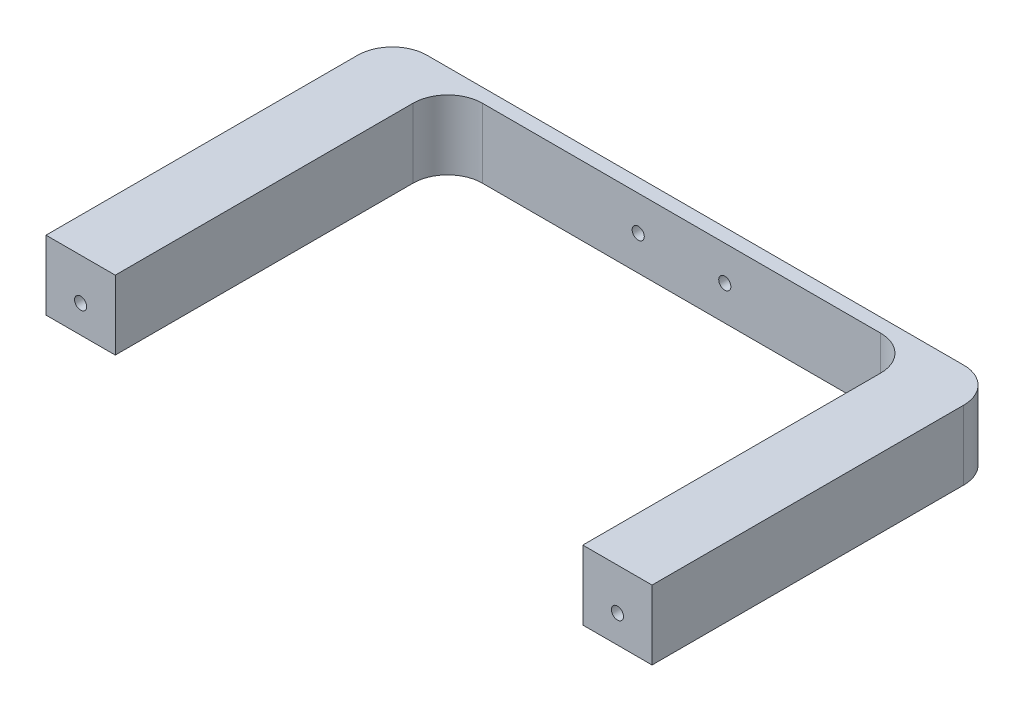
ISO-10303-21;
HEADER;
FILE_DESCRIPTION(('STEP AP214'),'2;1');
FILE_NAME('part.step','',(''),(''),'','','');
FILE_SCHEMA(('AUTOMOTIVE_DESIGN { 1 0 10303 214 1 1 1 1 }'));
ENDSEC;
DATA;
#1=APPLICATION_CONTEXT('core data for automotive mechanical design processes');
#2=APPLICATION_PROTOCOL_DEFINITION('international standard','automotive_design',2000,#1);
#3=PRODUCT_CONTEXT('',#1,'mechanical');
#4=PRODUCT('Part','Part','',(#3));
#5=PRODUCT_RELATED_PRODUCT_CATEGORY('part','',(#4));
#6=PRODUCT_DEFINITION_FORMATION('','',#4);
#7=PRODUCT_DEFINITION_CONTEXT('part definition',#1,'design');
#8=PRODUCT_DEFINITION('design','',#6,#7);
#9=PRODUCT_DEFINITION_SHAPE('','',#8);
#10=(LENGTH_UNIT() NAMED_UNIT(*) SI_UNIT(.MILLI.,.METRE.));
#11=(NAMED_UNIT(*) PLANE_ANGLE_UNIT() SI_UNIT($,.RADIAN.));
#12=(NAMED_UNIT(*) SI_UNIT($,.STERADIAN.) SOLID_ANGLE_UNIT());
#13=UNCERTAINTY_MEASURE_WITH_UNIT(LENGTH_MEASURE(1.E-05),#10,'distance_accuracy_value','');
#14=(GEOMETRIC_REPRESENTATION_CONTEXT(3) GLOBAL_UNCERTAINTY_ASSIGNED_CONTEXT((#13)) GLOBAL_UNIT_ASSIGNED_CONTEXT((#10,
#11,#12)) REPRESENTATION_CONTEXT('',''));
#15=CARTESIAN_POINT('',(0.,0.,0.));
#16=DIRECTION('',(0.,0.,1.));
#17=DIRECTION('',(1.,0.,0.));
#18=AXIS2_PLACEMENT_3D('',#15,#16,#17);
#19=CARTESIAN_POINT('',(0.,0.,0.));
#20=DIRECTION('',(0.,-1.,0.));
#21=DIRECTION('',(0.,0.,-1.));
#22=AXIS2_PLACEMENT_3D('',#19,#20,#21);
#23=PLANE('',#22);
#24=DIRECTION('',(1.,0.,0.));
#25=VECTOR('',#24,1.);
#26=CARTESIAN_POINT('',(159.,0.,-4.55999999999998));
#27=LINE('',#26,#25);
#28=CARTESIAN_POINT('',(159.,0.,-4.55999999999998));
#29=VERTEX_POINT('',#28);
#30=CARTESIAN_POINT('',(171.,0.,-4.55999999999998));
#31=VERTEX_POINT('',#30);
#32=EDGE_CURVE('E191',#29,#31,#27,.T.);
#33=ORIENTED_EDGE('',*,*,#32,.T.);
#34=DIRECTION('',(0.,0.,-1.));
#35=VECTOR('',#34,1.);
#36=CARTESIAN_POINT('',(171.,0.,-3.99999999999998));
#37=LINE('',#36,#35);
#38=CARTESIAN_POINT('',(171.,0.,-28.));
#39=VERTEX_POINT('',#38);
#40=EDGE_CURVE('E190',#31,#39,#37,.T.);
#41=ORIENTED_EDGE('',*,*,#40,.T.);
#42=DIRECTION('',(-1.,0.,0.));
#43=VECTOR('',#42,1.);
#44=CARTESIAN_POINT('',(171.,0.,-28.));
#45=LINE('',#44,#43);
#46=CARTESIAN_POINT('',(159.,0.,-28.));
#47=VERTEX_POINT('',#46);
#48=EDGE_CURVE('E207',#39,#47,#45,.T.);
#49=ORIENTED_EDGE('',*,*,#48,.T.);
#50=DIRECTION('',(0.,0.,1.));
#51=VECTOR('',#50,1.);
#52=CARTESIAN_POINT('',(159.,0.,-3.99999999999998));
#53=LINE('',#52,#51);
#54=EDGE_CURVE('E204',#47,#29,#53,.T.);
#55=ORIENTED_EDGE('',*,*,#54,.T.);
#56=EDGE_LOOP('',(#33,#41,#49,#55));
#57=FACE_BOUND('',#56,.T.);
#58=DIRECTION('',(-1.,0.,0.));
#59=VECTOR('',#58,1.);
#60=CARTESIAN_POINT('',(16.,0.,-4.56));
#61=LINE('',#60,#59);
#62=CARTESIAN_POINT('',(16.,0.,-4.56));
#63=VERTEX_POINT('',#62);
#64=CARTESIAN_POINT('',(4.,0.,-4.56));
#65=VERTEX_POINT('',#64);
#66=EDGE_CURVE('E686',#63,#65,#61,.T.);
#67=ORIENTED_EDGE('',*,*,#66,.F.);
#68=DIRECTION('',(0.,0.,1.));
#69=VECTOR('',#68,1.);
#70=CARTESIAN_POINT('',(16.,0.,-4.));
#71=LINE('',#70,#69);
#72=CARTESIAN_POINT('',(16.,0.,-28.));
#73=VERTEX_POINT('',#72);
#74=EDGE_CURVE('E220',#73,#63,#71,.T.);
#75=ORIENTED_EDGE('',*,*,#74,.F.);
#76=DIRECTION('',(1.,0.,0.));
#77=VECTOR('',#76,1.);
#78=CARTESIAN_POINT('',(4.,0.,-28.));
#79=LINE('',#78,#77);
#80=CARTESIAN_POINT('',(4.,0.,-28.));
#81=VERTEX_POINT('',#80);
#82=EDGE_CURVE('E228',#81,#73,#79,.T.);
#83=ORIENTED_EDGE('',*,*,#82,.F.);
#84=DIRECTION('',(0.,0.,-1.));
#85=VECTOR('',#84,1.);
#86=CARTESIAN_POINT('',(4.,0.,-4.));
#87=LINE('',#86,#85);
#88=EDGE_CURVE('E216',#65,#81,#87,.T.);
#89=ORIENTED_EDGE('',*,*,#88,.F.);
#90=EDGE_LOOP('',(#67,#75,#83,#89));
#91=FACE_BOUND('',#90,.T.);
#92=DIRECTION('',(-1.,0.,0.));
#93=VECTOR('',#92,1.);
#94=CARTESIAN_POINT('',(0.,0.,-100.));
#95=LINE('',#94,#93);
#96=CARTESIAN_POINT('',(165.,0.,-100.));
#97=VERTEX_POINT('',#96);
#98=CARTESIAN_POINT('',(10.,0.,-100.));
#99=VERTEX_POINT('',#98);
#100=EDGE_CURVE('E253',#97,#99,#95,.T.);
#101=ORIENTED_EDGE('',*,*,#100,.F.);
#102=CARTESIAN_POINT('',(165.,0.,-90.));
#103=DIRECTION('',(0.,-1.,0.));
#104=DIRECTION('',(0.,0.,-1.));
#105=AXIS2_PLACEMENT_3D('',#102,#103,#104);
#106=CIRCLE('',#105,10.);
#107=CARTESIAN_POINT('',(175.,0.,-90.));
#108=VERTEX_POINT('',#107);
#109=EDGE_CURVE('E318',#97,#108,#106,.T.);
#110=ORIENTED_EDGE('',*,*,#109,.T.);
#111=DIRECTION('',(0.,0.,-1.));
#112=VECTOR('',#111,1.);
#113=CARTESIAN_POINT('',(175.,0.,0.));
#114=LINE('',#113,#112);
#115=CARTESIAN_POINT('',(175.,0.,0.));
#116=VERTEX_POINT('',#115);
#117=EDGE_CURVE('E285',#116,#108,#114,.T.);
#118=ORIENTED_EDGE('',*,*,#117,.F.);
#119=DIRECTION('',(1.,0.,0.));
#120=VECTOR('',#119,1.);
#121=CARTESIAN_POINT('',(155.,0.,0.));
#122=LINE('',#121,#120);
#123=CARTESIAN_POINT('',(155.,0.,0.));
#124=VERTEX_POINT('',#123);
#125=EDGE_CURVE('E283',#124,#116,#122,.T.);
#126=ORIENTED_EDGE('',*,*,#125,.F.);
#127=DIRECTION('',(0.,0.,1.));
#128=VECTOR('',#127,1.);
#129=CARTESIAN_POINT('',(155.,0.,-96.));
#130=LINE('',#129,#128);
#131=CARTESIAN_POINT('',(155.,0.,-86.));
#132=VERTEX_POINT('',#131);
#133=EDGE_CURVE('E281',#132,#124,#130,.T.);
#134=ORIENTED_EDGE('',*,*,#133,.F.);
#135=CARTESIAN_POINT('',(145.,0.,-86.));
#136=DIRECTION('',(0.,-1.,0.));
#137=DIRECTION('',(0.,0.,-1.));
#138=AXIS2_PLACEMENT_3D('',#135,#136,#137);
#139=CIRCLE('',#138,10.);
#140=CARTESIAN_POINT('',(145.,0.,-96.));
#141=VERTEX_POINT('',#140);
#142=EDGE_CURVE('E329',#132,#141,#139,.F.);
#143=ORIENTED_EDGE('',*,*,#142,.T.);
#144=DIRECTION('',(1.,0.,0.));
#145=VECTOR('',#144,1.);
#146=CARTESIAN_POINT('',(20.,0.,-96.));
#147=LINE('',#146,#145);
#148=CARTESIAN_POINT('',(30.,0.,-96.));
#149=VERTEX_POINT('',#148);
#150=EDGE_CURVE('E278',#149,#141,#147,.T.);
#151=ORIENTED_EDGE('',*,*,#150,.F.);
#152=CARTESIAN_POINT('',(30.,0.,-86.));
#153=DIRECTION('',(0.,-1.,0.));
#154=DIRECTION('',(0.,0.,-1.));
#155=AXIS2_PLACEMENT_3D('',#152,#153,#154);
#156=CIRCLE('',#155,10.);
#157=CARTESIAN_POINT('',(20.,0.,-86.));
#158=VERTEX_POINT('',#157);
#159=EDGE_CURVE('E49',#149,#158,#156,.F.);
#160=ORIENTED_EDGE('',*,*,#159,.T.);
#161=DIRECTION('',(0.,0.,-1.));
#162=VECTOR('',#161,1.);
#163=CARTESIAN_POINT('',(20.,0.,0.));
#164=LINE('',#163,#162);
#165=CARTESIAN_POINT('',(20.,0.,0.));
#166=VERTEX_POINT('',#165);
#167=EDGE_CURVE('E275',#166,#158,#164,.T.);
#168=ORIENTED_EDGE('',*,*,#167,.F.);
#169=DIRECTION('',(1.,0.,0.));
#170=VECTOR('',#169,1.);
#171=CARTESIAN_POINT('',(0.,0.,0.));
#172=LINE('',#171,#170);
#173=CARTESIAN_POINT('',(0.,0.,0.));
#174=VERTEX_POINT('',#173);
#175=EDGE_CURVE('E273',#174,#166,#172,.T.);
#176=ORIENTED_EDGE('',*,*,#175,.F.);
#177=DIRECTION('',(0.,0.,1.));
#178=VECTOR('',#177,1.);
#179=CARTESIAN_POINT('',(0.,0.,0.));
#180=LINE('',#179,#178);
#181=CARTESIAN_POINT('',(0.,0.,-90.));
#182=VERTEX_POINT('',#181);
#183=EDGE_CURVE('E249',#182,#174,#180,.T.);
#184=ORIENTED_EDGE('',*,*,#183,.F.);
#185=CARTESIAN_POINT('',(10.,0.,-90.));
#186=DIRECTION('',(0.,-1.,0.));
#187=DIRECTION('',(0.,0.,-1.));
#188=AXIS2_PLACEMENT_3D('',#185,#186,#187);
#189=CIRCLE('',#188,10.);
#190=EDGE_CURVE('E316',#182,#99,#189,.T.);
#191=ORIENTED_EDGE('',*,*,#190,.T.);
#192=EDGE_LOOP('',(#101,#110,#118,#126,#134,#143,#151,#160,#168,#176,#184,#191));
#193=FACE_BOUND('',#192,.T.);
#194=ADVANCED_FACE('F41',(#57,#91,#193),#23,.T.);
#195=CARTESIAN_POINT('',(0.,20.,0.));
#196=DIRECTION('',(1.,0.,0.));
#197=DIRECTION('',(0.,0.,-1.));
#198=AXIS2_PLACEMENT_3D('',#195,#196,#197);
#199=PLANE('',#198);
#200=DIRECTION('',(0.,0.,1.));
#201=VECTOR('',#200,1.);
#202=CARTESIAN_POINT('',(0.,20.,0.));
#203=LINE('',#202,#201);
#204=CARTESIAN_POINT('',(0.,20.,-90.));
#205=VERTEX_POINT('',#204);
#206=CARTESIAN_POINT('',(0.,20.,0.));
#207=VERTEX_POINT('',#206);
#208=EDGE_CURVE('E250',#205,#207,#203,.T.);
#209=ORIENTED_EDGE('',*,*,#208,.F.);
#210=DIRECTION('',(0.,-1.,0.));
#211=VECTOR('',#210,1.);
#212=CARTESIAN_POINT('',(0.,20.,-90.));
#213=LINE('',#212,#211);
#214=EDGE_CURVE('E326',#205,#182,#213,.T.);
#215=ORIENTED_EDGE('',*,*,#214,.T.);
#216=ORIENTED_EDGE('',*,*,#183,.T.);
#217=DIRECTION('',(0.,-1.,0.));
#218=VECTOR('',#217,1.);
#219=CARTESIAN_POINT('',(0.,20.,0.));
#220=LINE('',#219,#218);
#221=EDGE_CURVE('E298',#207,#174,#220,.T.);
#222=ORIENTED_EDGE('',*,*,#221,.F.);
#223=EDGE_LOOP('',(#209,#215,#216,#222));
#224=FACE_BOUND('',#223,.T.);
#225=ADVANCED_FACE('F384',(#224),#199,.F.);
#226=CARTESIAN_POINT('',(0.,20.,0.));
#227=DIRECTION('',(0.,0.,-1.));
#228=DIRECTION('',(-1.,0.,0.));
#229=AXIS2_PLACEMENT_3D('',#226,#227,#228);
#230=PLANE('',#229);
#231=CARTESIAN_POINT('',(10.,8.,0.));
#232=DIRECTION('',(0.,0.,-1.));
#233=DIRECTION('',(-1.,0.,0.));
#234=AXIS2_PLACEMENT_3D('',#231,#232,#233);
#235=CIRCLE('',#234,1.75);
#236=CARTESIAN_POINT('',(8.25,8.,0.));
#237=VERTEX_POINT('',#236);
#238=EDGE_CURVE('E212',#237,#237,#235,.T.);
#239=ORIENTED_EDGE('',*,*,#238,.T.);
#240=EDGE_LOOP('',(#239));
#241=FACE_BOUND('',#240,.T.);
#242=ORIENTED_EDGE('',*,*,#175,.T.);
#243=DIRECTION('',(0.,-1.,0.));
#244=VECTOR('',#243,1.);
#245=CARTESIAN_POINT('',(20.,20.,0.));
#246=LINE('',#245,#244);
#247=CARTESIAN_POINT('',(20.,20.,0.));
#248=VERTEX_POINT('',#247);
#249=EDGE_CURVE('E295',#248,#166,#246,.T.);
#250=ORIENTED_EDGE('',*,*,#249,.F.);
#251=DIRECTION('',(1.,0.,0.));
#252=VECTOR('',#251,1.);
#253=CARTESIAN_POINT('',(0.,20.,0.));
#254=LINE('',#253,#252);
#255=EDGE_CURVE('E252',#207,#248,#254,.T.);
#256=ORIENTED_EDGE('',*,*,#255,.F.);
#257=ORIENTED_EDGE('',*,*,#221,.T.);
#258=EDGE_LOOP('',(#242,#250,#256,#257));
#259=FACE_BOUND('',#258,.T.);
#260=ADVANCED_FACE('F388',(#241,#259),#230,.F.);
#261=CARTESIAN_POINT('',(20.,20.,0.));
#262=DIRECTION('',(-1.,0.,0.));
#263=DIRECTION('',(0.,0.,1.));
#264=AXIS2_PLACEMENT_3D('',#261,#262,#263);
#265=PLANE('',#264);
#266=ORIENTED_EDGE('',*,*,#167,.T.);
#267=DIRECTION('',(0.,-1.,0.));
#268=VECTOR('',#267,1.);
#269=CARTESIAN_POINT('',(20.,20.,-86.));
#270=LINE('',#269,#268);
#271=CARTESIAN_POINT('',(20.,20.,-86.));
#272=VERTEX_POINT('',#271);
#273=EDGE_CURVE('E309',#158,#272,#270,.F.);
#274=ORIENTED_EDGE('',*,*,#273,.T.);
#275=DIRECTION('',(0.,0.,-1.));
#276=VECTOR('',#275,1.);
#277=CARTESIAN_POINT('',(20.,20.,0.));
#278=LINE('',#277,#276);
#279=EDGE_CURVE('E255',#248,#272,#278,.T.);
#280=ORIENTED_EDGE('',*,*,#279,.F.);
#281=ORIENTED_EDGE('',*,*,#249,.T.);
#282=EDGE_LOOP('',(#266,#274,#280,#281));
#283=FACE_BOUND('',#282,.T.);
#284=ADVANCED_FACE('F341',(#283),#265,.F.);
#285=CARTESIAN_POINT('',(20.,20.,-96.));
#286=DIRECTION('',(0.,0.,-1.));
#287=DIRECTION('',(-1.,0.,0.));
#288=AXIS2_PLACEMENT_3D('',#285,#286,#287);
#289=PLANE('',#288);
#290=CARTESIAN_POINT('',(100.,10.,-96.));
#291=DIRECTION('',(0.,0.,-1.));
#292=DIRECTION('',(-1.,0.,0.));
#293=AXIS2_PLACEMENT_3D('',#290,#291,#292);
#294=CIRCLE('',#293,1.75);
#295=CARTESIAN_POINT('',(98.25,10.,-96.));
#296=VERTEX_POINT('',#295);
#297=EDGE_CURVE('E246',#296,#296,#294,.T.);
#298=ORIENTED_EDGE('',*,*,#297,.T.);
#299=EDGE_LOOP('',(#298));
#300=FACE_BOUND('',#299,.T.);
#301=CARTESIAN_POINT('',(75.,10.,-96.));
#302=DIRECTION('',(0.,0.,-1.));
#303=DIRECTION('',(-1.,0.,0.));
#304=AXIS2_PLACEMENT_3D('',#301,#302,#303);
#305=CIRCLE('',#304,1.75);
#306=CARTESIAN_POINT('',(73.25,10.,-96.));
#307=VERTEX_POINT('',#306);
#308=EDGE_CURVE('E241',#307,#307,#305,.T.);
#309=ORIENTED_EDGE('',*,*,#308,.T.);
#310=EDGE_LOOP('',(#309));
#311=FACE_BOUND('',#310,.T.);
#312=ORIENTED_EDGE('',*,*,#150,.T.);
#313=DIRECTION('',(0.,-1.,0.));
#314=VECTOR('',#313,1.);
#315=CARTESIAN_POINT('',(145.,20.,-96.));
#316=LINE('',#315,#314);
#317=CARTESIAN_POINT('',(145.,20.,-96.));
#318=VERTEX_POINT('',#317);
#319=EDGE_CURVE('E307',#141,#318,#316,.F.);
#320=ORIENTED_EDGE('',*,*,#319,.T.);
#321=DIRECTION('',(1.,0.,0.));
#322=VECTOR('',#321,1.);
#323=CARTESIAN_POINT('',(20.,20.,-96.));
#324=LINE('',#323,#322);
#325=CARTESIAN_POINT('',(30.,20.,-96.));
#326=VERTEX_POINT('',#325);
#327=EDGE_CURVE('E258',#326,#318,#324,.T.);
#328=ORIENTED_EDGE('',*,*,#327,.F.);
#329=DIRECTION('',(0.,-1.,0.));
#330=VECTOR('',#329,1.);
#331=CARTESIAN_POINT('',(30.,0.,-96.));
#332=LINE('',#331,#330);
#333=EDGE_CURVE('E304',#326,#149,#332,.T.);
#334=ORIENTED_EDGE('',*,*,#333,.T.);
#335=EDGE_LOOP('',(#312,#320,#328,#334));
#336=FACE_BOUND('',#335,.T.);
#337=ADVANCED_FACE('F351',(#300,#311,#336),#289,.F.);
#338=CARTESIAN_POINT('',(155.,20.,-96.));
#339=DIRECTION('',(1.,0.,0.));
#340=DIRECTION('',(0.,0.,-1.));
#341=AXIS2_PLACEMENT_3D('',#338,#339,#340);
#342=PLANE('',#341);
#343=DIRECTION('',(0.,0.,1.));
#344=VECTOR('',#343,1.);
#345=CARTESIAN_POINT('',(155.,20.,-96.));
#346=LINE('',#345,#344);
#347=CARTESIAN_POINT('',(155.,20.,-86.));
#348=VERTEX_POINT('',#347);
#349=CARTESIAN_POINT('',(155.,20.,0.));
#350=VERTEX_POINT('',#349);
#351=EDGE_CURVE('E261',#348,#350,#346,.T.);
#352=ORIENTED_EDGE('',*,*,#351,.F.);
#353=DIRECTION('',(0.,-1.,0.));
#354=VECTOR('',#353,1.);
#355=CARTESIAN_POINT('',(155.,0.,-86.));
#356=LINE('',#355,#354);
#357=EDGE_CURVE('E301',#348,#132,#356,.T.);
#358=ORIENTED_EDGE('',*,*,#357,.T.);
#359=ORIENTED_EDGE('',*,*,#133,.T.);
#360=DIRECTION('',(0.,-1.,0.));
#361=VECTOR('',#360,1.);
#362=CARTESIAN_POINT('',(155.,20.,0.));
#363=LINE('',#362,#361);
#364=EDGE_CURVE('E292',#350,#124,#363,.T.);
#365=ORIENTED_EDGE('',*,*,#364,.F.);
#366=EDGE_LOOP('',(#352,#358,#359,#365));
#367=FACE_BOUND('',#366,.T.);
#368=ADVANCED_FACE('F359',(#367),#342,.F.);
#369=CARTESIAN_POINT('',(155.,20.,0.));
#370=DIRECTION('',(0.,0.,-1.));
#371=DIRECTION('',(-1.,0.,0.));
#372=AXIS2_PLACEMENT_3D('',#369,#370,#371);
#373=PLANE('',#372);
#374=CARTESIAN_POINT('',(165.,8.,0.));
#375=DIRECTION('',(0.,0.,1.));
#376=DIRECTION('',(1.,0.,0.));
#377=AXIS2_PLACEMENT_3D('',#374,#375,#376);
#378=CIRCLE('',#377,1.75);
#379=CARTESIAN_POINT('',(166.75,8.,0.));
#380=VERTEX_POINT('',#379);
#381=EDGE_CURVE('E208',#380,#380,#378,.T.);
#382=ORIENTED_EDGE('',*,*,#381,.F.);
#383=EDGE_LOOP('',(#382));
#384=FACE_BOUND('',#383,.T.);
#385=ORIENTED_EDGE('',*,*,#125,.T.);
#386=DIRECTION('',(0.,-1.,0.));
#387=VECTOR('',#386,1.);
#388=CARTESIAN_POINT('',(175.,20.,0.));
#389=LINE('',#388,#387);
#390=CARTESIAN_POINT('',(175.,20.,0.));
#391=VERTEX_POINT('',#390);
#392=EDGE_CURVE('E271',#391,#116,#389,.T.);
#393=ORIENTED_EDGE('',*,*,#392,.F.);
#394=DIRECTION('',(1.,0.,0.));
#395=VECTOR('',#394,1.);
#396=CARTESIAN_POINT('',(155.,20.,0.));
#397=LINE('',#396,#395);
#398=EDGE_CURVE('E263',#350,#391,#397,.T.);
#399=ORIENTED_EDGE('',*,*,#398,.F.);
#400=ORIENTED_EDGE('',*,*,#364,.T.);
#401=EDGE_LOOP('',(#385,#393,#399,#400));
#402=FACE_BOUND('',#401,.T.);
#403=ADVANCED_FACE('F365',(#384,#402),#373,.F.);
#404=CARTESIAN_POINT('',(175.,20.,0.));
#405=DIRECTION('',(-1.,0.,0.));
#406=DIRECTION('',(0.,0.,1.));
#407=AXIS2_PLACEMENT_3D('',#404,#405,#406);
#408=PLANE('',#407);
#409=ORIENTED_EDGE('',*,*,#117,.T.);
#410=DIRECTION('',(0.,-1.,0.));
#411=VECTOR('',#410,1.);
#412=CARTESIAN_POINT('',(175.,20.,-90.));
#413=LINE('',#412,#411);
#414=CARTESIAN_POINT('',(175.,20.,-90.));
#415=VERTEX_POINT('',#414);
#416=EDGE_CURVE('E320',#108,#415,#413,.F.);
#417=ORIENTED_EDGE('',*,*,#416,.T.);
#418=DIRECTION('',(0.,0.,-1.));
#419=VECTOR('',#418,1.);
#420=CARTESIAN_POINT('',(175.,20.,0.));
#421=LINE('',#420,#419);
#422=EDGE_CURVE('E265',#391,#415,#421,.T.);
#423=ORIENTED_EDGE('',*,*,#422,.F.);
#424=ORIENTED_EDGE('',*,*,#392,.T.);
#425=EDGE_LOOP('',(#409,#417,#423,#424));
#426=FACE_BOUND('',#425,.T.);
#427=ADVANCED_FACE('F413',(#426),#408,.F.);
#428=CARTESIAN_POINT('',(0.,20.,-100.));
#429=DIRECTION('',(0.,0.,1.));
#430=DIRECTION('',(1.,0.,0.));
#431=AXIS2_PLACEMENT_3D('',#428,#429,#430);
#432=PLANE('',#431);
#433=CARTESIAN_POINT('',(100.,10.,-100.));
#434=DIRECTION('',(0.,0.,-1.));
#435=DIRECTION('',(-1.,0.,0.));
#436=AXIS2_PLACEMENT_3D('',#433,#434,#435);
#437=CIRCLE('',#436,1.75);
#438=CARTESIAN_POINT('',(98.25,10.,-100.));
#439=VERTEX_POINT('',#438);
#440=EDGE_CURVE('E238',#439,#439,#437,.T.);
#441=ORIENTED_EDGE('',*,*,#440,.F.);
#442=EDGE_LOOP('',(#441));
#443=FACE_BOUND('',#442,.T.);
#444=CARTESIAN_POINT('',(75.,10.,-100.));
#445=DIRECTION('',(0.,0.,-1.));
#446=DIRECTION('',(-1.,0.,0.));
#447=AXIS2_PLACEMENT_3D('',#444,#445,#446);
#448=CIRCLE('',#447,1.75);
#449=CARTESIAN_POINT('',(73.25,10.,-100.));
#450=VERTEX_POINT('',#449);
#451=EDGE_CURVE('E235',#450,#450,#448,.T.);
#452=ORIENTED_EDGE('',*,*,#451,.F.);
#453=EDGE_LOOP('',(#452));
#454=FACE_BOUND('',#453,.T.);
#455=DIRECTION('',(-1.,0.,0.));
#456=VECTOR('',#455,1.);
#457=CARTESIAN_POINT('',(0.,20.,-100.));
#458=LINE('',#457,#456);
#459=CARTESIAN_POINT('',(165.,20.,-100.));
#460=VERTEX_POINT('',#459);
#461=CARTESIAN_POINT('',(10.,20.,-100.));
#462=VERTEX_POINT('',#461);
#463=EDGE_CURVE('E268',#460,#462,#458,.T.);
#464=ORIENTED_EDGE('',*,*,#463,.F.);
#465=DIRECTION('',(0.,-1.,0.));
#466=VECTOR('',#465,1.);
#467=CARTESIAN_POINT('',(165.,20.,-100.));
#468=LINE('',#467,#466);
#469=EDGE_CURVE('E313',#460,#97,#468,.T.);
#470=ORIENTED_EDGE('',*,*,#469,.T.);
#471=ORIENTED_EDGE('',*,*,#100,.T.);
#472=DIRECTION('',(0.,-1.,0.));
#473=VECTOR('',#472,1.);
#474=CARTESIAN_POINT('',(10.,20.,-100.));
#475=LINE('',#474,#473);
#476=EDGE_CURVE('E311',#99,#462,#475,.F.);
#477=ORIENTED_EDGE('',*,*,#476,.T.);
#478=EDGE_LOOP('',(#464,#470,#471,#477));
#479=FACE_BOUND('',#478,.T.);
#480=ADVANCED_FACE('F375',(#443,#454,#479),#432,.F.);
#481=CARTESIAN_POINT('',(0.,20.,0.));
#482=DIRECTION('',(0.,-1.,0.));
#483=DIRECTION('',(0.,0.,-1.));
#484=AXIS2_PLACEMENT_3D('',#481,#482,#483);
#485=PLANE('',#484);
#486=ORIENTED_EDGE('',*,*,#422,.T.);
#487=CARTESIAN_POINT('',(165.,20.,-90.));
#488=DIRECTION('',(0.,-1.,0.));
#489=DIRECTION('',(0.,0.,-1.));
#490=AXIS2_PLACEMENT_3D('',#487,#488,#489);
#491=CIRCLE('',#490,10.);
#492=EDGE_CURVE('E324',#415,#460,#491,.F.);
#493=ORIENTED_EDGE('',*,*,#492,.T.);
#494=ORIENTED_EDGE('',*,*,#463,.T.);
#495=CARTESIAN_POINT('',(10.,20.,-90.));
#496=DIRECTION('',(0.,-1.,0.));
#497=DIRECTION('',(0.,0.,-1.));
#498=AXIS2_PLACEMENT_3D('',#495,#496,#497);
#499=CIRCLE('',#498,10.);
#500=EDGE_CURVE('E322',#462,#205,#499,.F.);
#501=ORIENTED_EDGE('',*,*,#500,.T.);
#502=ORIENTED_EDGE('',*,*,#208,.T.);
#503=ORIENTED_EDGE('',*,*,#255,.T.);
#504=ORIENTED_EDGE('',*,*,#279,.T.);
#505=CARTESIAN_POINT('',(30.,20.,-86.));
#506=DIRECTION('',(0.,-1.,0.));
#507=DIRECTION('',(0.,0.,-1.));
#508=AXIS2_PLACEMENT_3D('',#505,#506,#507);
#509=CIRCLE('',#508,10.);
#510=EDGE_CURVE('E11',#272,#326,#509,.T.);
#511=ORIENTED_EDGE('',*,*,#510,.T.);
#512=ORIENTED_EDGE('',*,*,#327,.T.);
#513=CARTESIAN_POINT('',(145.,20.,-86.));
#514=DIRECTION('',(0.,-1.,0.));
#515=DIRECTION('',(0.,0.,-1.));
#516=AXIS2_PLACEMENT_3D('',#513,#514,#515);
#517=CIRCLE('',#516,10.);
#518=EDGE_CURVE('E331',#318,#348,#517,.T.);
#519=ORIENTED_EDGE('',*,*,#518,.T.);
#520=ORIENTED_EDGE('',*,*,#351,.T.);
#521=ORIENTED_EDGE('',*,*,#398,.T.);
#522=EDGE_LOOP('',(#486,#493,#494,#501,#502,#503,#504,#511,#512,#519,#520,#521));
#523=FACE_BOUND('',#522,.T.);
#524=ADVANCED_FACE('F348',(#523),#485,.F.);
#525=CARTESIAN_POINT('',(145.,20.,-86.));
#526=DIRECTION('',(0.,1.,0.));
#527=DIRECTION('',(0.,0.,1.));
#528=AXIS2_PLACEMENT_3D('',#525,#526,#527);
#529=CYLINDRICAL_SURFACE('',#528,10.);
#530=ORIENTED_EDGE('',*,*,#518,.F.);
#531=ORIENTED_EDGE('',*,*,#319,.F.);
#532=ORIENTED_EDGE('',*,*,#142,.F.);
#533=ORIENTED_EDGE('',*,*,#357,.F.);
#534=EDGE_LOOP('',(#530,#531,#532,#533));
#535=FACE_BOUND('',#534,.T.);
#536=ADVANCED_FACE('F354',(#535),#529,.F.);
#537=CARTESIAN_POINT('',(30.,20.,-86.));
#538=DIRECTION('',(0.,1.,0.));
#539=DIRECTION('',(0.,0.,1.));
#540=AXIS2_PLACEMENT_3D('',#537,#538,#539);
#541=CYLINDRICAL_SURFACE('',#540,10.);
#542=ORIENTED_EDGE('',*,*,#510,.F.);
#543=ORIENTED_EDGE('',*,*,#273,.F.);
#544=ORIENTED_EDGE('',*,*,#159,.F.);
#545=ORIENTED_EDGE('',*,*,#333,.F.);
#546=EDGE_LOOP('',(#542,#543,#544,#545));
#547=FACE_BOUND('',#546,.T.);
#548=ADVANCED_FACE('F345',(#547),#541,.F.);
#549=CARTESIAN_POINT('',(165.,20.,-90.));
#550=DIRECTION('',(0.,-1.,0.));
#551=DIRECTION('',(0.,0.,-1.));
#552=AXIS2_PLACEMENT_3D('',#549,#550,#551);
#553=CYLINDRICAL_SURFACE('',#552,10.);
#554=ORIENTED_EDGE('',*,*,#492,.F.);
#555=ORIENTED_EDGE('',*,*,#416,.F.);
#556=ORIENTED_EDGE('',*,*,#109,.F.);
#557=ORIENTED_EDGE('',*,*,#469,.F.);
#558=EDGE_LOOP('',(#554,#555,#556,#557));
#559=FACE_BOUND('',#558,.T.);
#560=ADVANCED_FACE('F373',(#559),#553,.T.);
#561=CARTESIAN_POINT('',(10.,20.,-90.));
#562=DIRECTION('',(0.,-1.,0.));
#563=DIRECTION('',(0.,0.,-1.));
#564=AXIS2_PLACEMENT_3D('',#561,#562,#563);
#565=CYLINDRICAL_SURFACE('',#564,10.);
#566=ORIENTED_EDGE('',*,*,#500,.F.);
#567=ORIENTED_EDGE('',*,*,#476,.F.);
#568=ORIENTED_EDGE('',*,*,#190,.F.);
#569=ORIENTED_EDGE('',*,*,#214,.F.);
#570=EDGE_LOOP('',(#566,#567,#568,#569));
#571=FACE_BOUND('',#570,.T.);
#572=ADVANCED_FACE('F43',(#571),#565,.T.);
#573=CARTESIAN_POINT('',(75.,10.,0.));
#574=DIRECTION('',(0.,0.,-1.));
#575=DIRECTION('',(-1.,0.,0.));
#576=AXIS2_PLACEMENT_3D('',#573,#574,#575);
#577=CYLINDRICAL_SURFACE('',#576,1.75);
#578=ORIENTED_EDGE('',*,*,#451,.T.);
#579=EDGE_LOOP('',(#578));
#580=FACE_BOUND('',#579,.T.);
#581=ORIENTED_EDGE('',*,*,#308,.F.);
#582=EDGE_LOOP('',(#581));
#583=FACE_BOUND('',#582,.T.);
#584=ADVANCED_FACE('F431',(#580,#583),#577,.F.);
#585=CARTESIAN_POINT('',(100.,10.,0.));
#586=DIRECTION('',(0.,0.,-1.));
#587=DIRECTION('',(-1.,0.,0.));
#588=AXIS2_PLACEMENT_3D('',#585,#586,#587);
#589=CYLINDRICAL_SURFACE('',#588,1.75);
#590=ORIENTED_EDGE('',*,*,#440,.T.);
#591=EDGE_LOOP('',(#590));
#592=FACE_BOUND('',#591,.T.);
#593=ORIENTED_EDGE('',*,*,#297,.F.);
#594=EDGE_LOOP('',(#593));
#595=FACE_BOUND('',#594,.T.);
#596=ADVANCED_FACE('F433',(#592,#595),#589,.F.);
#597=CARTESIAN_POINT('',(16.,16.,-4.));
#598=DIRECTION('',(1.,0.,0.));
#599=DIRECTION('',(0.,0.,-1.));
#600=AXIS2_PLACEMENT_3D('',#597,#598,#599);
#601=PLANE('',#600);
#602=ORIENTED_EDGE('',*,*,#74,.T.);
#603=DIRECTION('',(0.,-1.,0.));
#604=VECTOR('',#603,1.);
#605=CARTESIAN_POINT('',(16.,16.,-4.56));
#606=LINE('',#605,#604);
#607=CARTESIAN_POINT('',(16.,16.,-4.56));
#608=VERTEX_POINT('',#607);
#609=EDGE_CURVE('E683',#608,#63,#606,.T.);
#610=ORIENTED_EDGE('',*,*,#609,.F.);
#611=DIRECTION('',(0.,0.,1.));
#612=VECTOR('',#611,1.);
#613=CARTESIAN_POINT('',(16.,16.,-4.));
#614=LINE('',#613,#612);
#615=CARTESIAN_POINT('',(16.,16.,-28.));
#616=VERTEX_POINT('',#615);
#617=EDGE_CURVE('E223',#616,#608,#614,.T.);
#618=ORIENTED_EDGE('',*,*,#617,.F.);
#619=DIRECTION('',(0.,-1.,0.));
#620=VECTOR('',#619,1.);
#621=CARTESIAN_POINT('',(16.,16.,-28.));
#622=LINE('',#621,#620);
#623=EDGE_CURVE('E233',#616,#73,#622,.T.);
#624=ORIENTED_EDGE('',*,*,#623,.T.);
#625=EDGE_LOOP('',(#602,#610,#618,#624));
#626=FACE_BOUND('',#625,.T.);
#627=ADVANCED_FACE('F438',(#626),#601,.F.);
#628=CARTESIAN_POINT('',(4.,16.,-28.));
#629=DIRECTION('',(0.,0.,-1.));
#630=DIRECTION('',(-1.,0.,0.));
#631=AXIS2_PLACEMENT_3D('',#628,#629,#630);
#632=PLANE('',#631);
#633=ORIENTED_EDGE('',*,*,#82,.T.);
#634=ORIENTED_EDGE('',*,*,#623,.F.);
#635=DIRECTION('',(1.,0.,0.));
#636=VECTOR('',#635,1.);
#637=CARTESIAN_POINT('',(4.,16.,-28.));
#638=LINE('',#637,#636);
#639=CARTESIAN_POINT('',(4.,16.,-28.));
#640=VERTEX_POINT('',#639);
#641=EDGE_CURVE('E219',#640,#616,#638,.T.);
#642=ORIENTED_EDGE('',*,*,#641,.F.);
#643=DIRECTION('',(0.,-1.,0.));
#644=VECTOR('',#643,1.);
#645=CARTESIAN_POINT('',(4.,16.,-28.));
#646=LINE('',#645,#644);
#647=EDGE_CURVE('E226',#640,#81,#646,.T.);
#648=ORIENTED_EDGE('',*,*,#647,.T.);
#649=EDGE_LOOP('',(#633,#634,#642,#648));
#650=FACE_BOUND('',#649,.T.);
#651=ADVANCED_FACE('F446',(#650),#632,.F.);
#652=CARTESIAN_POINT('',(4.,16.,-4.));
#653=DIRECTION('',(-1.,0.,0.));
#654=DIRECTION('',(0.,0.,1.));
#655=AXIS2_PLACEMENT_3D('',#652,#653,#654);
#656=PLANE('',#655);
#657=DIRECTION('',(0.,0.,-1.));
#658=VECTOR('',#657,1.);
#659=CARTESIAN_POINT('',(4.,16.,-4.));
#660=LINE('',#659,#658);
#661=CARTESIAN_POINT('',(4.,16.,-4.56));
#662=VERTEX_POINT('',#661);
#663=EDGE_CURVE('E217',#662,#640,#660,.T.);
#664=ORIENTED_EDGE('',*,*,#663,.F.);
#665=DIRECTION('',(0.,1.,0.));
#666=VECTOR('',#665,1.);
#667=CARTESIAN_POINT('',(4.,16.,-4.56));
#668=LINE('',#667,#666);
#669=EDGE_CURVE('E64',#65,#662,#668,.T.);
#670=ORIENTED_EDGE('',*,*,#669,.F.);
#671=ORIENTED_EDGE('',*,*,#88,.T.);
#672=ORIENTED_EDGE('',*,*,#647,.F.);
#673=EDGE_LOOP('',(#664,#670,#671,#672));
#674=FACE_BOUND('',#673,.T.);
#675=ADVANCED_FACE('F442',(#674),#656,.F.);
#676=CARTESIAN_POINT('',(0.,16.,0.));
#677=DIRECTION('',(0.,1.,0.));
#678=DIRECTION('',(0.,0.,1.));
#679=AXIS2_PLACEMENT_3D('',#676,#677,#678);
#680=PLANE('',#679);
#681=ORIENTED_EDGE('',*,*,#617,.T.);
#682=DIRECTION('',(1.,0.,0.));
#683=VECTOR('',#682,1.);
#684=CARTESIAN_POINT('',(16.,16.,-4.56));
#685=LINE('',#684,#683);
#686=EDGE_CURVE('E678',#662,#608,#685,.T.);
#687=ORIENTED_EDGE('',*,*,#686,.F.);
#688=ORIENTED_EDGE('',*,*,#663,.T.);
#689=ORIENTED_EDGE('',*,*,#641,.T.);
#690=EDGE_LOOP('',(#681,#687,#688,#689));
#691=FACE_BOUND('',#690,.T.);
#692=ADVANCED_FACE('F445',(#691),#680,.F.);
#693=CARTESIAN_POINT('',(10.,8.,0.));
#694=DIRECTION('',(0.,0.,-1.));
#695=DIRECTION('',(-1.,0.,0.));
#696=AXIS2_PLACEMENT_3D('',#693,#694,#695);
#697=CYLINDRICAL_SURFACE('',#696,1.75);
#698=ORIENTED_EDGE('',*,*,#238,.F.);
#699=EDGE_LOOP('',(#698));
#700=FACE_BOUND('',#699,.T.);
#701=CARTESIAN_POINT('',(10.,8.,-4.));
#702=DIRECTION('',(0.,0.,-1.));
#703=DIRECTION('',(-1.,0.,0.));
#704=AXIS2_PLACEMENT_3D('',#701,#702,#703);
#705=CIRCLE('',#704,1.75);
#706=CARTESIAN_POINT('',(8.25,8.,-4.));
#707=VERTEX_POINT('',#706);
#708=EDGE_CURVE('E673',#707,#707,#705,.F.);
#709=ORIENTED_EDGE('',*,*,#708,.F.);
#710=EDGE_LOOP('',(#709));
#711=FACE_BOUND('',#710,.T.);
#712=ADVANCED_FACE('F455',(#700,#711),#697,.F.);
#713=CARTESIAN_POINT('',(171.,16.,-3.99999999999998));
#714=DIRECTION('',(-1.,0.,0.));
#715=DIRECTION('',(0.,0.,1.));
#716=AXIS2_PLACEMENT_3D('',#713,#714,#715);
#717=PLANE('',#716);
#718=DIRECTION('',(0.,1.,0.));
#719=VECTOR('',#718,1.);
#720=CARTESIAN_POINT('',(171.,16.,-4.55999999999998));
#721=LINE('',#720,#719);
#722=CARTESIAN_POINT('',(171.,16.,-4.55999999999998));
#723=VERTEX_POINT('',#722);
#724=EDGE_CURVE('E177',#31,#723,#721,.T.);
#725=ORIENTED_EDGE('',*,*,#724,.T.);
#726=DIRECTION('',(0.,0.,-1.));
#727=VECTOR('',#726,1.);
#728=CARTESIAN_POINT('',(171.,16.,-3.99999999999998));
#729=LINE('',#728,#727);
#730=CARTESIAN_POINT('',(171.,16.,-28.));
#731=VERTEX_POINT('',#730);
#732=EDGE_CURVE('E188',#723,#731,#729,.T.);
#733=ORIENTED_EDGE('',*,*,#732,.T.);
#734=DIRECTION('',(0.,-1.,0.));
#735=VECTOR('',#734,1.);
#736=CARTESIAN_POINT('',(171.,16.,-28.));
#737=LINE('',#736,#735);
#738=EDGE_CURVE('E198',#731,#39,#737,.T.);
#739=ORIENTED_EDGE('',*,*,#738,.T.);
#740=ORIENTED_EDGE('',*,*,#40,.F.);
#741=EDGE_LOOP('',(#725,#733,#739,#740));
#742=FACE_BOUND('',#741,.T.);
#743=ADVANCED_FACE('F186',(#742),#717,.T.);
#744=CARTESIAN_POINT('',(171.,16.,-28.));
#745=DIRECTION('',(0.,0.,1.));
#746=DIRECTION('',(1.,0.,0.));
#747=AXIS2_PLACEMENT_3D('',#744,#745,#746);
#748=PLANE('',#747);
#749=ORIENTED_EDGE('',*,*,#48,.F.);
#750=ORIENTED_EDGE('',*,*,#738,.F.);
#751=DIRECTION('',(-1.,0.,0.));
#752=VECTOR('',#751,1.);
#753=CARTESIAN_POINT('',(171.,16.,-28.));
#754=LINE('',#753,#752);
#755=CARTESIAN_POINT('',(159.,16.,-28.));
#756=VERTEX_POINT('',#755);
#757=EDGE_CURVE('E195',#731,#756,#754,.T.);
#758=ORIENTED_EDGE('',*,*,#757,.T.);
#759=DIRECTION('',(0.,-1.,0.));
#760=VECTOR('',#759,1.);
#761=CARTESIAN_POINT('',(159.,16.,-28.));
#762=LINE('',#761,#760);
#763=EDGE_CURVE('E196',#756,#47,#762,.T.);
#764=ORIENTED_EDGE('',*,*,#763,.T.);
#765=EDGE_LOOP('',(#749,#750,#758,#764));
#766=FACE_BOUND('',#765,.T.);
#767=ADVANCED_FACE('F462',(#766),#748,.T.);
#768=CARTESIAN_POINT('',(159.,16.,-3.99999999999998));
#769=DIRECTION('',(1.,0.,0.));
#770=DIRECTION('',(0.,0.,-1.));
#771=AXIS2_PLACEMENT_3D('',#768,#769,#770);
#772=PLANE('',#771);
#773=DIRECTION('',(0.,-1.,0.));
#774=VECTOR('',#773,1.);
#775=CARTESIAN_POINT('',(159.,16.,-4.55999999999998));
#776=LINE('',#775,#774);
#777=CARTESIAN_POINT('',(159.,16.,-4.55999999999998));
#778=VERTEX_POINT('',#777);
#779=EDGE_CURVE('E56',#778,#29,#776,.T.);
#780=ORIENTED_EDGE('',*,*,#779,.T.);
#781=ORIENTED_EDGE('',*,*,#54,.F.);
#782=ORIENTED_EDGE('',*,*,#763,.F.);
#783=DIRECTION('',(0.,0.,1.));
#784=VECTOR('',#783,1.);
#785=CARTESIAN_POINT('',(159.,16.,-3.99999999999998));
#786=LINE('',#785,#784);
#787=EDGE_CURVE('E200',#756,#778,#786,.T.);
#788=ORIENTED_EDGE('',*,*,#787,.T.);
#789=EDGE_LOOP('',(#780,#781,#782,#788));
#790=FACE_BOUND('',#789,.T.);
#791=ADVANCED_FACE('F459',(#790),#772,.T.);
#792=CARTESIAN_POINT('',(175.,16.,0.));
#793=DIRECTION('',(0.,1.,0.));
#794=DIRECTION('',(0.,0.,1.));
#795=AXIS2_PLACEMENT_3D('',#792,#793,#794);
#796=PLANE('',#795);
#797=ORIENTED_EDGE('',*,*,#732,.F.);
#798=DIRECTION('',(-1.,0.,0.));
#799=VECTOR('',#798,1.);
#800=CARTESIAN_POINT('',(159.,16.,-4.55999999999998));
#801=LINE('',#800,#799);
#802=EDGE_CURVE('E174',#723,#778,#801,.T.);
#803=ORIENTED_EDGE('',*,*,#802,.T.);
#804=ORIENTED_EDGE('',*,*,#787,.F.);
#805=ORIENTED_EDGE('',*,*,#757,.F.);
#806=EDGE_LOOP('',(#797,#803,#804,#805));
#807=FACE_BOUND('',#806,.T.);
#808=ADVANCED_FACE('F194',(#807),#796,.F.);
#809=CARTESIAN_POINT('',(165.,8.,0.));
#810=DIRECTION('',(0.,0.,-1.));
#811=DIRECTION('',(-1.,0.,0.));
#812=AXIS2_PLACEMENT_3D('',#809,#810,#811);
#813=CYLINDRICAL_SURFACE('',#812,1.75);
#814=ORIENTED_EDGE('',*,*,#381,.T.);
#815=EDGE_LOOP('',(#814));
#816=FACE_BOUND('',#815,.T.);
#817=CARTESIAN_POINT('',(165.,8.,-3.99999999999998));
#818=DIRECTION('',(0.,0.,1.));
#819=DIRECTION('',(1.,0.,0.));
#820=AXIS2_PLACEMENT_3D('',#817,#818,#819);
#821=CIRCLE('',#820,1.75);
#822=CARTESIAN_POINT('',(166.75,8.,-3.99999999999998));
#823=VERTEX_POINT('',#822);
#824=EDGE_CURVE('E671',#823,#823,#821,.T.);
#825=ORIENTED_EDGE('',*,*,#824,.F.);
#826=EDGE_LOOP('',(#825));
#827=FACE_BOUND('',#826,.T.);
#828=ADVANCED_FACE('F470',(#816,#827),#813,.F.);
#829=CARTESIAN_POINT('',(0.,0.,-4.));
#830=DIRECTION('',(0.,0.,-1.));
#831=DIRECTION('',(-1.,0.,0.));
#832=AXIS2_PLACEMENT_3D('',#829,#830,#831);
#833=PLANE('',#832);
#834=ORIENTED_EDGE('',*,*,#708,.T.);
#835=EDGE_LOOP('',(#834));
#836=FACE_BOUND('',#835,.T.);
#837=ADVANCED_FACE('F473',(#836),#833,.F.);
#838=CARTESIAN_POINT('',(0.,0.,-4.56));
#839=DIRECTION('',(0.,0.,-1.));
#840=DIRECTION('',(-1.,0.,0.));
#841=AXIS2_PLACEMENT_3D('',#838,#839,#840);
#842=PLANE('',#841);
#843=ORIENTED_EDGE('',*,*,#609,.T.);
#844=ORIENTED_EDGE('',*,*,#66,.T.);
#845=ORIENTED_EDGE('',*,*,#669,.T.);
#846=ORIENTED_EDGE('',*,*,#686,.T.);
#847=EDGE_LOOP('',(#843,#844,#845,#846));
#848=FACE_BOUND('',#847,.T.);
#849=ADVANCED_FACE('F477',(#848),#842,.T.);
#850=CARTESIAN_POINT('',(175.,0.,-3.99999999999998));
#851=DIRECTION('',(0.,0.,-1.));
#852=DIRECTION('',(1.,0.,0.));
#853=AXIS2_PLACEMENT_3D('',#850,#851,#852);
#854=PLANE('',#853);
#855=ORIENTED_EDGE('',*,*,#824,.T.);
#856=EDGE_LOOP('',(#855));
#857=FACE_BOUND('',#856,.T.);
#858=ADVANCED_FACE('F480',(#857),#854,.F.);
#859=CARTESIAN_POINT('',(175.,0.,-4.55999999999998));
#860=DIRECTION('',(0.,0.,-1.));
#861=DIRECTION('',(1.,0.,0.));
#862=AXIS2_PLACEMENT_3D('',#859,#860,#861);
#863=PLANE('',#862);
#864=ORIENTED_EDGE('',*,*,#779,.F.);
#865=ORIENTED_EDGE('',*,*,#802,.F.);
#866=ORIENTED_EDGE('',*,*,#724,.F.);
#867=ORIENTED_EDGE('',*,*,#32,.F.);
#868=EDGE_LOOP('',(#864,#865,#866,#867));
#869=FACE_BOUND('',#868,.T.);
#870=ADVANCED_FACE('F176',(#869),#863,.T.);
#871=CLOSED_SHELL('',(#194,#225,#260,#284,#337,#368,#403,#427,#480,#524,#536,#548,#560,#572,
#584,#596,#627,#651,#675,#692,#712,#743,#767,#791,#808,#828,#837,#849,#858,#870));
#872=MANIFOLD_SOLID_BREP('B2',#871);
#873=ADVANCED_BREP_SHAPE_REPRESENTATION('',(#18,#872),#14);
#874=SHAPE_DEFINITION_REPRESENTATION(#9,#873);
ENDSEC;
END-ISO-10303-21;
